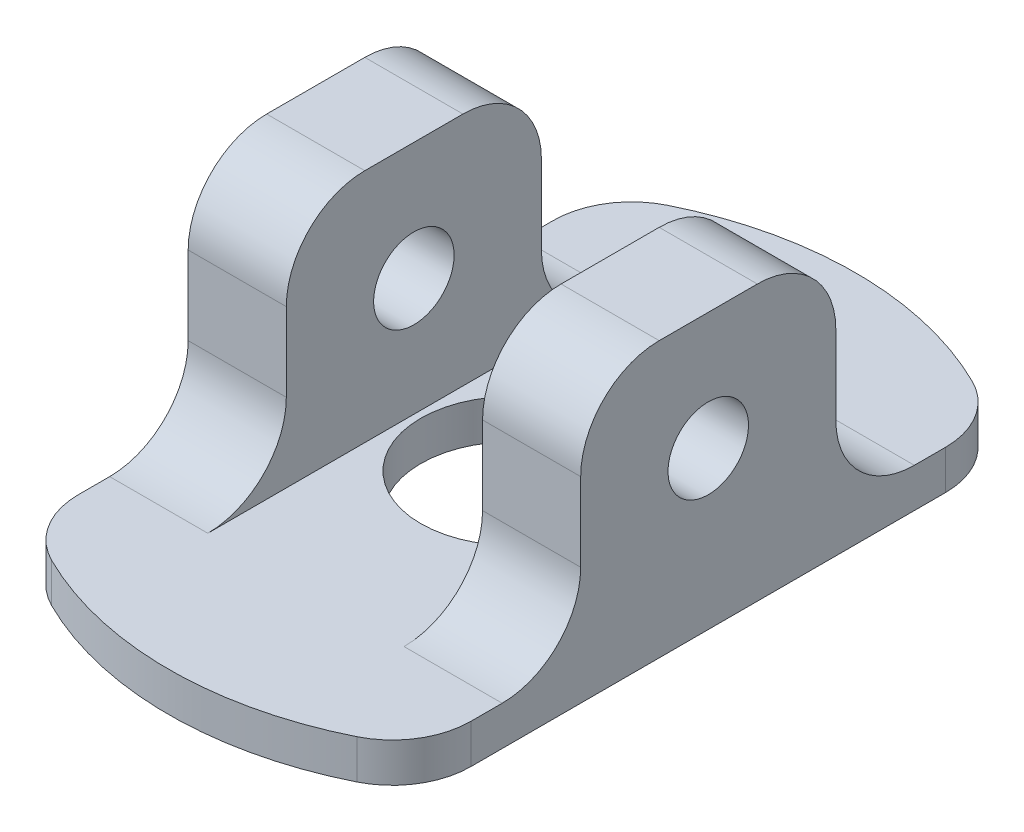
ISO-10303-21;
HEADER;
FILE_DESCRIPTION(('STEP AP214'),'2;1');
FILE_NAME('part.step','',(''),(''),'','','');
FILE_SCHEMA(('AUTOMOTIVE_DESIGN { 1 0 10303 214 1 1 1 1 }'));
ENDSEC;
DATA;
#1=APPLICATION_CONTEXT('core data for automotive mechanical design processes');
#2=APPLICATION_PROTOCOL_DEFINITION('international standard','automotive_design',2000,#1);
#3=PRODUCT_CONTEXT('',#1,'mechanical');
#4=PRODUCT('Part','Part','',(#3));
#5=PRODUCT_RELATED_PRODUCT_CATEGORY('part','',(#4));
#6=PRODUCT_DEFINITION_FORMATION('','',#4);
#7=PRODUCT_DEFINITION_CONTEXT('part definition',#1,'design');
#8=PRODUCT_DEFINITION('design','',#6,#7);
#9=PRODUCT_DEFINITION_SHAPE('','',#8);
#10=(LENGTH_UNIT() NAMED_UNIT(*) SI_UNIT(.MILLI.,.METRE.));
#11=(NAMED_UNIT(*) PLANE_ANGLE_UNIT() SI_UNIT($,.RADIAN.));
#12=(NAMED_UNIT(*) SI_UNIT($,.STERADIAN.) SOLID_ANGLE_UNIT());
#13=UNCERTAINTY_MEASURE_WITH_UNIT(LENGTH_MEASURE(1.E-05),#10,'distance_accuracy_value','');
#14=(GEOMETRIC_REPRESENTATION_CONTEXT(3) GLOBAL_UNCERTAINTY_ASSIGNED_CONTEXT((#13)) GLOBAL_UNIT_ASSIGNED_CONTEXT((#10,
#11,#12)) REPRESENTATION_CONTEXT('',''));
#15=CARTESIAN_POINT('',(0.,0.,0.));
#16=DIRECTION('',(0.,0.,1.));
#17=DIRECTION('',(1.,0.,0.));
#18=AXIS2_PLACEMENT_3D('',#15,#16,#17);
#19=CARTESIAN_POINT('',(0.,14.,0.));
#20=DIRECTION('',(0.,-1.,0.));
#21=DIRECTION('',(0.,0.,-1.));
#22=AXIS2_PLACEMENT_3D('',#19,#20,#21);
#23=CYLINDRICAL_SURFACE('',#22,17.5);
#24=CARTESIAN_POINT('',(0.,14.,0.));
#25=DIRECTION('',(0.,1.,0.));
#26=DIRECTION('',(0.,0.,1.));
#27=AXIS2_PLACEMENT_3D('',#24,#25,#26);
#28=CIRCLE('',#27,17.5);
#29=CARTESIAN_POINT('',(-7.77777777777778,14.,15.6766122883583));
#30=VERTEX_POINT('',#29);
#31=CARTESIAN_POINT('',(7.77777777777778,14.,15.6766122883583));
#32=VERTEX_POINT('',#31);
#33=EDGE_CURVE('E291',#30,#32,#28,.T.);
#34=ORIENTED_EDGE('',*,*,#33,.F.);
#35=DIRECTION('',(0.,-1.,0.));
#36=VECTOR('',#35,1.);
#37=CARTESIAN_POINT('',(-7.77777777777778,14.,15.6766122883583));
#38=LINE('',#37,#36);
#39=CARTESIAN_POINT('',(-7.77777777777778,12.,15.6766122883583));
#40=VERTEX_POINT('',#39);
#41=EDGE_CURVE('E11',#30,#40,#38,.T.);
#42=ORIENTED_EDGE('',*,*,#41,.T.);
#43=CARTESIAN_POINT('',(0.,12.,0.));
#44=DIRECTION('',(0.,1.,0.));
#45=DIRECTION('',(0.,0.,1.));
#46=AXIS2_PLACEMENT_3D('',#43,#44,#45);
#47=CIRCLE('',#46,17.5);
#48=CARTESIAN_POINT('',(7.77777777777778,12.,15.6766122883583));
#49=VERTEX_POINT('',#48);
#50=EDGE_CURVE('E293',#40,#49,#47,.T.);
#51=ORIENTED_EDGE('',*,*,#50,.T.);
#52=DIRECTION('',(0.,-1.,0.));
#53=VECTOR('',#52,1.);
#54=CARTESIAN_POINT('',(7.77777777777778,14.,15.6766122883583));
#55=LINE('',#54,#53);
#56=EDGE_CURVE('E42',#49,#32,#55,.F.);
#57=ORIENTED_EDGE('',*,*,#56,.T.);
#58=EDGE_LOOP('',(#34,#42,#51,#57));
#59=FACE_BOUND('',#58,.T.);
#60=ADVANCED_FACE('F34',(#59),#23,.T.);
#61=CARTESIAN_POINT('',(0.,14.,0.));
#62=DIRECTION('',(0.,1.,0.));
#63=DIRECTION('',(0.,0.,1.));
#64=AXIS2_PLACEMENT_3D('',#61,#62,#63);
#65=PLANE('',#64);
#66=CARTESIAN_POINT('',(0.,14.,0.));
#67=DIRECTION('',(0.,1.,0.));
#68=DIRECTION('',(0.,0.,1.));
#69=AXIS2_PLACEMENT_3D('',#66,#67,#68);
#70=CIRCLE('',#69,4.65);
#71=CARTESIAN_POINT('',(0.,14.,4.65));
#72=VERTEX_POINT('',#71);
#73=EDGE_CURVE('E408',#72,#72,#70,.T.);
#74=ORIENTED_EDGE('',*,*,#73,.F.);
#75=EDGE_LOOP('',(#74));
#76=FACE_BOUND('',#75,.T.);
#77=DIRECTION('',(0.,0.,-1.));
#78=VECTOR('',#77,1.);
#79=CARTESIAN_POINT('',(10.,14.,0.));
#80=LINE('',#79,#78);
#81=CARTESIAN_POINT('',(10.,14.,-10.5));
#82=VERTEX_POINT('',#81);
#83=CARTESIAN_POINT('',(10.,14.,-12.0933866224478));
#84=VERTEX_POINT('',#83);
#85=EDGE_CURVE('E399',#82,#84,#80,.T.);
#86=ORIENTED_EDGE('',*,*,#85,.T.);
#87=CARTESIAN_POINT('',(6.,14.,-12.0933866224478));
#88=DIRECTION('',(0.,1.,0.));
#89=DIRECTION('',(0.,0.,1.));
#90=AXIS2_PLACEMENT_3D('',#87,#88,#89);
#91=CIRCLE('',#90,4.);
#92=CARTESIAN_POINT('',(7.77777777777777,14.,-15.6766122883583));
#93=VERTEX_POINT('',#92);
#94=EDGE_CURVE('E268',#84,#93,#91,.T.);
#95=ORIENTED_EDGE('',*,*,#94,.T.);
#96=CARTESIAN_POINT('',(-7.77777777777777,14.,-15.6766122883583));
#97=VERTEX_POINT('',#96);
#98=EDGE_CURVE('E298',#93,#97,#28,.T.);
#99=ORIENTED_EDGE('',*,*,#98,.T.);
#100=CARTESIAN_POINT('',(-6.,14.,-12.0933866224478));
#101=DIRECTION('',(0.,1.,0.));
#102=DIRECTION('',(0.,0.,1.));
#103=AXIS2_PLACEMENT_3D('',#100,#101,#102);
#104=CIRCLE('',#103,4.);
#105=CARTESIAN_POINT('',(-10.,14.,-12.0933866224478));
#106=VERTEX_POINT('',#105);
#107=EDGE_CURVE('E203',#97,#106,#104,.T.);
#108=ORIENTED_EDGE('',*,*,#107,.T.);
#109=DIRECTION('',(0.,0.,-1.));
#110=VECTOR('',#109,1.);
#111=CARTESIAN_POINT('',(-10.,14.,0.));
#112=LINE('',#111,#110);
#113=CARTESIAN_POINT('',(-10.,14.,-10.5));
#114=VERTEX_POINT('',#113);
#115=EDGE_CURVE('E195',#114,#106,#112,.T.);
#116=ORIENTED_EDGE('',*,*,#115,.F.);
#117=DIRECTION('',(-1.,0.,0.));
#118=VECTOR('',#117,1.);
#119=CARTESIAN_POINT('',(0.,14.,-10.5));
#120=LINE('',#119,#118);
#121=CARTESIAN_POINT('',(-5.,14.,-10.5));
#122=VERTEX_POINT('',#121);
#123=EDGE_CURVE('E200',#114,#122,#120,.F.);
#124=ORIENTED_EDGE('',*,*,#123,.T.);
#125=DIRECTION('',(0.,0.,1.));
#126=VECTOR('',#125,1.);
#127=CARTESIAN_POINT('',(-5.,14.,-6.5));
#128=LINE('',#127,#126);
#129=CARTESIAN_POINT('',(-5.,14.,10.5));
#130=VERTEX_POINT('',#129);
#131=EDGE_CURVE('E388',#122,#130,#128,.T.);
#132=ORIENTED_EDGE('',*,*,#131,.T.);
#133=DIRECTION('',(-1.,0.,0.));
#134=VECTOR('',#133,1.);
#135=CARTESIAN_POINT('',(-10.,14.,10.5));
#136=LINE('',#135,#134);
#137=CARTESIAN_POINT('',(-10.,14.,10.5));
#138=VERTEX_POINT('',#137);
#139=EDGE_CURVE('E220',#130,#138,#136,.T.);
#140=ORIENTED_EDGE('',*,*,#139,.T.);
#141=CARTESIAN_POINT('',(-10.,14.,12.0933866224478));
#142=VERTEX_POINT('',#141);
#143=EDGE_CURVE('E204',#142,#138,#112,.T.);
#144=ORIENTED_EDGE('',*,*,#143,.F.);
#145=CARTESIAN_POINT('',(-6.,14.,12.0933866224478));
#146=DIRECTION('',(0.,1.,0.));
#147=DIRECTION('',(0.,0.,1.));
#148=AXIS2_PLACEMENT_3D('',#145,#146,#147);
#149=CIRCLE('',#148,4.);
#150=EDGE_CURVE('E265',#142,#30,#149,.T.);
#151=ORIENTED_EDGE('',*,*,#150,.T.);
#152=ORIENTED_EDGE('',*,*,#33,.T.);
#153=CARTESIAN_POINT('',(6.,14.,12.0933866224478));
#154=DIRECTION('',(0.,1.,0.));
#155=DIRECTION('',(0.,0.,1.));
#156=AXIS2_PLACEMENT_3D('',#153,#154,#155);
#157=CIRCLE('',#156,4.);
#158=CARTESIAN_POINT('',(10.,14.,12.0933866224478));
#159=VERTEX_POINT('',#158);
#160=EDGE_CURVE('E263',#32,#159,#157,.T.);
#161=ORIENTED_EDGE('',*,*,#160,.T.);
#162=CARTESIAN_POINT('',(10.,14.,10.5));
#163=VERTEX_POINT('',#162);
#164=EDGE_CURVE('E346',#159,#163,#80,.T.);
#165=ORIENTED_EDGE('',*,*,#164,.T.);
#166=DIRECTION('',(1.,0.,0.));
#167=VECTOR('',#166,1.);
#168=CARTESIAN_POINT('',(0.,14.,10.5));
#169=LINE('',#168,#167);
#170=CARTESIAN_POINT('',(5.,14.,10.5));
#171=VERTEX_POINT('',#170);
#172=EDGE_CURVE('E226',#163,#171,#169,.F.);
#173=ORIENTED_EDGE('',*,*,#172,.T.);
#174=DIRECTION('',(0.,0.,1.));
#175=VECTOR('',#174,1.);
#176=CARTESIAN_POINT('',(5.,14.,-6.5));
#177=LINE('',#176,#175);
#178=CARTESIAN_POINT('',(5.,14.,-10.5));
#179=VERTEX_POINT('',#178);
#180=EDGE_CURVE('E345',#179,#171,#177,.T.);
#181=ORIENTED_EDGE('',*,*,#180,.F.);
#182=DIRECTION('',(1.,0.,0.));
#183=VECTOR('',#182,1.);
#184=CARTESIAN_POINT('',(10.,14.,-10.5));
#185=LINE('',#184,#183);
#186=EDGE_CURVE('E219',#179,#82,#185,.T.);
#187=ORIENTED_EDGE('',*,*,#186,.T.);
#188=EDGE_LOOP('',(#86,#95,#99,#108,#116,#124,#132,#140,#144,#151,#152,#161,#165,#173,#181,#187));
#189=FACE_BOUND('',#188,.T.);
#190=ADVANCED_FACE('F198',(#76,#189),#65,.T.);
#191=ORIENTED_EDGE('',*,*,#98,.F.);
#192=DIRECTION('',(0.,-1.,0.));
#193=VECTOR('',#192,1.);
#194=CARTESIAN_POINT('',(7.77777777777778,14.,-15.6766122883583));
#195=LINE('',#194,#193);
#196=CARTESIAN_POINT('',(7.77777777777777,12.,-15.6766122883583));
#197=VERTEX_POINT('',#196);
#198=EDGE_CURVE('E273',#93,#197,#195,.T.);
#199=ORIENTED_EDGE('',*,*,#198,.T.);
#200=CARTESIAN_POINT('',(-7.77777777777777,12.,-15.6766122883583));
#201=VERTEX_POINT('',#200);
#202=EDGE_CURVE('E299',#197,#201,#47,.T.);
#203=ORIENTED_EDGE('',*,*,#202,.T.);
#204=DIRECTION('',(0.,-1.,0.));
#205=VECTOR('',#204,1.);
#206=CARTESIAN_POINT('',(-7.77777777777778,14.,-15.6766122883583));
#207=LINE('',#206,#205);
#208=EDGE_CURVE('E270',#201,#97,#207,.F.);
#209=ORIENTED_EDGE('',*,*,#208,.T.);
#210=EDGE_LOOP('',(#191,#199,#203,#209));
#211=FACE_BOUND('',#210,.T.);
#212=ADVANCED_FACE('F428',(#211),#23,.T.);
#213=CARTESIAN_POINT('',(0.,12.,0.));
#214=DIRECTION('',(0.,1.,0.));
#215=DIRECTION('',(0.,0.,1.));
#216=AXIS2_PLACEMENT_3D('',#213,#214,#215);
#217=PLANE('',#216);
#218=CARTESIAN_POINT('',(0.,12.,0.));
#219=DIRECTION('',(0.,1.,0.));
#220=DIRECTION('',(0.,0.,1.));
#221=AXIS2_PLACEMENT_3D('',#218,#219,#220);
#222=CIRCLE('',#221,4.65);
#223=CARTESIAN_POINT('',(0.,12.,4.65));
#224=VERTEX_POINT('',#223);
#225=EDGE_CURVE('E411',#224,#224,#222,.T.);
#226=ORIENTED_EDGE('',*,*,#225,.T.);
#227=EDGE_LOOP('',(#226));
#228=FACE_BOUND('',#227,.T.);
#229=ORIENTED_EDGE('',*,*,#202,.F.);
#230=CARTESIAN_POINT('',(6.,12.,-12.0933866224478));
#231=DIRECTION('',(0.,1.,0.));
#232=DIRECTION('',(0.,0.,1.));
#233=AXIS2_PLACEMENT_3D('',#230,#231,#232);
#234=CIRCLE('',#233,4.);
#235=CARTESIAN_POINT('',(10.,12.,-12.0933866224478));
#236=VERTEX_POINT('',#235);
#237=EDGE_CURVE('E280',#197,#236,#234,.F.);
#238=ORIENTED_EDGE('',*,*,#237,.T.);
#239=DIRECTION('',(0.,0.,-1.));
#240=VECTOR('',#239,1.);
#241=CARTESIAN_POINT('',(10.,12.,0.));
#242=LINE('',#241,#240);
#243=CARTESIAN_POINT('',(10.,12.,12.0933866224478));
#244=VERTEX_POINT('',#243);
#245=EDGE_CURVE('E391',#244,#236,#242,.T.);
#246=ORIENTED_EDGE('',*,*,#245,.F.);
#247=CARTESIAN_POINT('',(6.,12.,12.0933866224478));
#248=DIRECTION('',(0.,1.,0.));
#249=DIRECTION('',(0.,0.,1.));
#250=AXIS2_PLACEMENT_3D('',#247,#248,#249);
#251=CIRCLE('',#250,4.);
#252=EDGE_CURVE('E275',#244,#49,#251,.F.);
#253=ORIENTED_EDGE('',*,*,#252,.T.);
#254=ORIENTED_EDGE('',*,*,#50,.F.);
#255=CARTESIAN_POINT('',(-6.,12.,12.0933866224478));
#256=DIRECTION('',(0.,1.,0.));
#257=DIRECTION('',(0.,0.,1.));
#258=AXIS2_PLACEMENT_3D('',#255,#256,#257);
#259=CIRCLE('',#258,4.);
#260=CARTESIAN_POINT('',(-10.,12.,12.0933866224478));
#261=VERTEX_POINT('',#260);
#262=EDGE_CURVE('E56',#40,#261,#259,.F.);
#263=ORIENTED_EDGE('',*,*,#262,.T.);
#264=DIRECTION('',(0.,0.,-1.));
#265=VECTOR('',#264,1.);
#266=CARTESIAN_POINT('',(-10.,12.,0.));
#267=LINE('',#266,#265);
#268=CARTESIAN_POINT('',(-10.,12.,-12.0933866224478));
#269=VERTEX_POINT('',#268);
#270=EDGE_CURVE('E400',#261,#269,#267,.T.);
#271=ORIENTED_EDGE('',*,*,#270,.T.);
#272=CARTESIAN_POINT('',(-6.,12.,-12.0933866224478));
#273=DIRECTION('',(0.,1.,0.));
#274=DIRECTION('',(0.,0.,1.));
#275=AXIS2_PLACEMENT_3D('',#272,#273,#274);
#276=CIRCLE('',#275,4.);
#277=EDGE_CURVE('E278',#269,#201,#276,.F.);
#278=ORIENTED_EDGE('',*,*,#277,.T.);
#279=EDGE_LOOP('',(#229,#238,#246,#253,#254,#263,#271,#278));
#280=FACE_BOUND('',#279,.T.);
#281=ADVANCED_FACE('F415',(#228,#280),#217,.F.);
#282=CARTESIAN_POINT('',(5.,26.,-6.5));
#283=DIRECTION('',(1.,0.,0.));
#284=DIRECTION('',(0.,0.,-1.));
#285=AXIS2_PLACEMENT_3D('',#282,#283,#284);
#286=PLANE('',#285);
#287=CARTESIAN_POINT('',(5.,20.,0.));
#288=DIRECTION('',(1.,0.,0.));
#289=DIRECTION('',(0.,0.,-1.));
#290=AXIS2_PLACEMENT_3D('',#287,#288,#289);
#291=CIRCLE('',#290,2.05);
#292=CARTESIAN_POINT('',(5.,20.,-2.05));
#293=VERTEX_POINT('',#292);
#294=EDGE_CURVE('E205',#293,#293,#291,.T.);
#295=ORIENTED_EDGE('',*,*,#294,.T.);
#296=EDGE_LOOP('',(#295));
#297=FACE_BOUND('',#296,.T.);
#298=DIRECTION('',(0.,0.,1.));
#299=VECTOR('',#298,1.);
#300=CARTESIAN_POINT('',(5.,26.,-6.5));
#301=LINE('',#300,#299);
#302=CARTESIAN_POINT('',(5.,26.,-2.5));
#303=VERTEX_POINT('',#302);
#304=CARTESIAN_POINT('',(5.,26.,2.5));
#305=VERTEX_POINT('',#304);
#306=EDGE_CURVE('E372',#303,#305,#301,.T.);
#307=ORIENTED_EDGE('',*,*,#306,.F.);
#308=CARTESIAN_POINT('',(5.,22.,-2.5));
#309=DIRECTION('',(1.,0.,0.));
#310=DIRECTION('',(0.,0.,-1.));
#311=AXIS2_PLACEMENT_3D('',#308,#309,#310);
#312=CIRCLE('',#311,4.);
#313=CARTESIAN_POINT('',(5.,22.,-6.5));
#314=VERTEX_POINT('',#313);
#315=EDGE_CURVE('E336',#303,#314,#312,.F.);
#316=ORIENTED_EDGE('',*,*,#315,.T.);
#317=DIRECTION('',(0.,-1.,0.));
#318=VECTOR('',#317,1.);
#319=CARTESIAN_POINT('',(5.,26.,-6.5));
#320=LINE('',#319,#318);
#321=CARTESIAN_POINT('',(5.,18.,-6.5));
#322=VERTEX_POINT('',#321);
#323=EDGE_CURVE('E365',#314,#322,#320,.T.);
#324=ORIENTED_EDGE('',*,*,#323,.T.);
#325=CARTESIAN_POINT('',(5.,18.,-10.5));
#326=DIRECTION('',(1.,0.,0.));
#327=DIRECTION('',(0.,0.,-1.));
#328=AXIS2_PLACEMENT_3D('',#325,#326,#327);
#329=CIRCLE('',#328,4.);
#330=EDGE_CURVE('E216',#322,#179,#329,.T.);
#331=ORIENTED_EDGE('',*,*,#330,.T.);
#332=ORIENTED_EDGE('',*,*,#180,.T.);
#333=CARTESIAN_POINT('',(5.,18.,10.5));
#334=DIRECTION('',(1.,0.,0.));
#335=DIRECTION('',(0.,0.,-1.));
#336=AXIS2_PLACEMENT_3D('',#333,#334,#335);
#337=CIRCLE('',#336,4.);
#338=CARTESIAN_POINT('',(5.,18.,6.5));
#339=VERTEX_POINT('',#338);
#340=EDGE_CURVE('E251',#171,#339,#337,.T.);
#341=ORIENTED_EDGE('',*,*,#340,.T.);
#342=DIRECTION('',(0.,-1.,0.));
#343=VECTOR('',#342,1.);
#344=CARTESIAN_POINT('',(5.,26.,6.5));
#345=LINE('',#344,#343);
#346=CARTESIAN_POINT('',(5.,22.,6.5));
#347=VERTEX_POINT('',#346);
#348=EDGE_CURVE('E305',#347,#339,#345,.T.);
#349=ORIENTED_EDGE('',*,*,#348,.F.);
#350=CARTESIAN_POINT('',(5.,22.,2.5));
#351=DIRECTION('',(1.,0.,0.));
#352=DIRECTION('',(0.,0.,-1.));
#353=AXIS2_PLACEMENT_3D('',#350,#351,#352);
#354=CIRCLE('',#353,4.);
#355=EDGE_CURVE('E334',#347,#305,#354,.F.);
#356=ORIENTED_EDGE('',*,*,#355,.T.);
#357=EDGE_LOOP('',(#307,#316,#324,#331,#332,#341,#349,#356));
#358=FACE_BOUND('',#357,.T.);
#359=ADVANCED_FACE('F354',(#297,#358),#286,.F.);
#360=CARTESIAN_POINT('',(5.,26.,6.5));
#361=DIRECTION('',(0.,0.,-1.));
#362=DIRECTION('',(-1.,0.,0.));
#363=AXIS2_PLACEMENT_3D('',#360,#361,#362);
#364=PLANE('',#363);
#365=ORIENTED_EDGE('',*,*,#348,.T.);
#366=DIRECTION('',(1.,0.,0.));
#367=VECTOR('',#366,1.);
#368=CARTESIAN_POINT('',(5.,18.,6.5));
#369=LINE('',#368,#367);
#370=CARTESIAN_POINT('',(10.,18.,6.5));
#371=VERTEX_POINT('',#370);
#372=EDGE_CURVE('E235',#339,#371,#369,.T.);
#373=ORIENTED_EDGE('',*,*,#372,.T.);
#374=DIRECTION('',(0.,-1.,0.));
#375=VECTOR('',#374,1.);
#376=CARTESIAN_POINT('',(10.,26.,6.5));
#377=LINE('',#376,#375);
#378=CARTESIAN_POINT('',(10.,22.,6.5));
#379=VERTEX_POINT('',#378);
#380=EDGE_CURVE('E361',#379,#371,#377,.T.);
#381=ORIENTED_EDGE('',*,*,#380,.F.);
#382=DIRECTION('',(1.,0.,0.));
#383=VECTOR('',#382,1.);
#384=CARTESIAN_POINT('',(5.,22.,6.5));
#385=LINE('',#384,#383);
#386=EDGE_CURVE('E338',#379,#347,#385,.F.);
#387=ORIENTED_EDGE('',*,*,#386,.T.);
#388=EDGE_LOOP('',(#365,#373,#381,#387));
#389=FACE_BOUND('',#388,.T.);
#390=ADVANCED_FACE('F357',(#389),#364,.F.);
#391=CARTESIAN_POINT('',(10.,26.,-6.5));
#392=DIRECTION('',(1.,0.,0.));
#393=DIRECTION('',(0.,0.,-1.));
#394=AXIS2_PLACEMENT_3D('',#391,#392,#393);
#395=PLANE('',#394);
#396=CARTESIAN_POINT('',(10.,20.,0.));
#397=DIRECTION('',(1.,0.,0.));
#398=DIRECTION('',(0.,0.,-1.));
#399=AXIS2_PLACEMENT_3D('',#396,#397,#398);
#400=CIRCLE('',#399,2.05);
#401=CARTESIAN_POINT('',(10.,20.,-2.05));
#402=VERTEX_POINT('',#401);
#403=EDGE_CURVE('E258',#402,#402,#400,.T.);
#404=ORIENTED_EDGE('',*,*,#403,.F.);
#405=EDGE_LOOP('',(#404));
#406=FACE_BOUND('',#405,.T.);
#407=ORIENTED_EDGE('',*,*,#245,.T.);
#408=DIRECTION('',(0.,1.,0.));
#409=VECTOR('',#408,1.);
#410=CARTESIAN_POINT('',(10.,14.,-12.0933866224478));
#411=LINE('',#410,#409);
#412=EDGE_CURVE('E260',#236,#84,#411,.T.);
#413=ORIENTED_EDGE('',*,*,#412,.T.);
#414=ORIENTED_EDGE('',*,*,#85,.F.);
#415=CARTESIAN_POINT('',(10.,18.,-10.5));
#416=DIRECTION('',(1.,0.,0.));
#417=DIRECTION('',(0.,0.,-1.));
#418=AXIS2_PLACEMENT_3D('',#415,#416,#417);
#419=CIRCLE('',#418,4.);
#420=CARTESIAN_POINT('',(10.,18.,-6.5));
#421=VERTEX_POINT('',#420);
#422=EDGE_CURVE('E238',#82,#421,#419,.F.);
#423=ORIENTED_EDGE('',*,*,#422,.T.);
#424=DIRECTION('',(0.,-1.,0.));
#425=VECTOR('',#424,1.);
#426=CARTESIAN_POINT('',(10.,26.,-6.5));
#427=LINE('',#426,#425);
#428=CARTESIAN_POINT('',(10.,22.,-6.5));
#429=VERTEX_POINT('',#428);
#430=EDGE_CURVE('E362',#429,#421,#427,.T.);
#431=ORIENTED_EDGE('',*,*,#430,.F.);
#432=CARTESIAN_POINT('',(10.,22.,-2.5));
#433=DIRECTION('',(1.,0.,0.));
#434=DIRECTION('',(0.,0.,-1.));
#435=AXIS2_PLACEMENT_3D('',#432,#433,#434);
#436=CIRCLE('',#435,4.);
#437=CARTESIAN_POINT('',(10.,26.,-2.5));
#438=VERTEX_POINT('',#437);
#439=EDGE_CURVE('E327',#429,#438,#436,.T.);
#440=ORIENTED_EDGE('',*,*,#439,.T.);
#441=DIRECTION('',(0.,0.,1.));
#442=VECTOR('',#441,1.);
#443=CARTESIAN_POINT('',(10.,26.,-6.5));
#444=LINE('',#443,#442);
#445=CARTESIAN_POINT('',(10.,26.,2.5));
#446=VERTEX_POINT('',#445);
#447=EDGE_CURVE('E370',#438,#446,#444,.T.);
#448=ORIENTED_EDGE('',*,*,#447,.T.);
#449=CARTESIAN_POINT('',(10.,22.,2.5));
#450=DIRECTION('',(1.,0.,0.));
#451=DIRECTION('',(0.,0.,-1.));
#452=AXIS2_PLACEMENT_3D('',#449,#450,#451);
#453=CIRCLE('',#452,4.);
#454=EDGE_CURVE('E325',#446,#379,#453,.T.);
#455=ORIENTED_EDGE('',*,*,#454,.T.);
#456=ORIENTED_EDGE('',*,*,#380,.T.);
#457=CARTESIAN_POINT('',(10.,18.,10.5));
#458=DIRECTION('',(1.,0.,0.));
#459=DIRECTION('',(0.,0.,-1.));
#460=AXIS2_PLACEMENT_3D('',#457,#458,#459);
#461=CIRCLE('',#460,4.);
#462=EDGE_CURVE('E248',#371,#163,#461,.F.);
#463=ORIENTED_EDGE('',*,*,#462,.T.);
#464=ORIENTED_EDGE('',*,*,#164,.F.);
#465=DIRECTION('',(0.,1.,0.));
#466=VECTOR('',#465,1.);
#467=CARTESIAN_POINT('',(10.,12.,12.0933866224478));
#468=LINE('',#467,#466);
#469=EDGE_CURVE('E253',#159,#244,#468,.F.);
#470=ORIENTED_EDGE('',*,*,#469,.T.);
#471=EDGE_LOOP('',(#407,#413,#414,#423,#431,#440,#448,#455,#456,#463,#464,#470));
#472=FACE_BOUND('',#471,.T.);
#473=ADVANCED_FACE('F451',(#406,#472),#395,.T.);
#474=CARTESIAN_POINT('',(5.,26.,-6.5));
#475=DIRECTION('',(0.,0.,-1.));
#476=DIRECTION('',(-1.,0.,0.));
#477=AXIS2_PLACEMENT_3D('',#474,#475,#476);
#478=PLANE('',#477);
#479=ORIENTED_EDGE('',*,*,#430,.T.);
#480=DIRECTION('',(1.,0.,0.));
#481=VECTOR('',#480,1.);
#482=CARTESIAN_POINT('',(5.,18.,-6.5));
#483=LINE('',#482,#481);
#484=EDGE_CURVE('E223',#421,#322,#483,.F.);
#485=ORIENTED_EDGE('',*,*,#484,.T.);
#486=ORIENTED_EDGE('',*,*,#323,.F.);
#487=DIRECTION('',(1.,0.,0.));
#488=VECTOR('',#487,1.);
#489=CARTESIAN_POINT('',(5.,22.,-6.5));
#490=LINE('',#489,#488);
#491=EDGE_CURVE('E322',#314,#429,#490,.T.);
#492=ORIENTED_EDGE('',*,*,#491,.T.);
#493=EDGE_LOOP('',(#479,#485,#486,#492));
#494=FACE_BOUND('',#493,.T.);
#495=ADVANCED_FACE('F493',(#494),#478,.T.);
#496=CARTESIAN_POINT('',(0.,26.,0.));
#497=DIRECTION('',(0.,1.,0.));
#498=DIRECTION('',(0.,0.,1.));
#499=AXIS2_PLACEMENT_3D('',#496,#497,#498);
#500=PLANE('',#499);
#501=ORIENTED_EDGE('',*,*,#447,.F.);
#502=DIRECTION('',(1.,0.,0.));
#503=VECTOR('',#502,1.);
#504=CARTESIAN_POINT('',(0.,26.,-2.5));
#505=LINE('',#504,#503);
#506=EDGE_CURVE('E332',#438,#303,#505,.F.);
#507=ORIENTED_EDGE('',*,*,#506,.T.);
#508=ORIENTED_EDGE('',*,*,#306,.T.);
#509=DIRECTION('',(1.,0.,0.));
#510=VECTOR('',#509,1.);
#511=CARTESIAN_POINT('',(10.,26.,2.5));
#512=LINE('',#511,#510);
#513=EDGE_CURVE('E329',#305,#446,#512,.T.);
#514=ORIENTED_EDGE('',*,*,#513,.T.);
#515=EDGE_LOOP('',(#501,#507,#508,#514));
#516=FACE_BOUND('',#515,.T.);
#517=ADVANCED_FACE('F485',(#516),#500,.T.);
#518=CARTESIAN_POINT('',(-5.,26.,-6.5));
#519=DIRECTION('',(1.,0.,0.));
#520=DIRECTION('',(0.,0.,-1.));
#521=AXIS2_PLACEMENT_3D('',#518,#519,#520);
#522=PLANE('',#521);
#523=CARTESIAN_POINT('',(-5.,20.,0.));
#524=DIRECTION('',(1.,0.,0.));
#525=DIRECTION('',(0.,0.,-1.));
#526=AXIS2_PLACEMENT_3D('',#523,#524,#525);
#527=CIRCLE('',#526,2.05);
#528=CARTESIAN_POINT('',(-5.,20.,-2.05));
#529=VERTEX_POINT('',#528);
#530=EDGE_CURVE('E257',#529,#529,#527,.T.);
#531=ORIENTED_EDGE('',*,*,#530,.F.);
#532=EDGE_LOOP('',(#531));
#533=FACE_BOUND('',#532,.T.);
#534=DIRECTION('',(0.,-1.,0.));
#535=VECTOR('',#534,1.);
#536=CARTESIAN_POINT('',(-5.,26.,-6.5));
#537=LINE('',#536,#535);
#538=CARTESIAN_POINT('',(-5.,22.,-6.5));
#539=VERTEX_POINT('',#538);
#540=CARTESIAN_POINT('',(-5.,18.,-6.5));
#541=VERTEX_POINT('',#540);
#542=EDGE_CURVE('E373',#539,#541,#537,.T.);
#543=ORIENTED_EDGE('',*,*,#542,.F.);
#544=CARTESIAN_POINT('',(-5.,22.,-2.5));
#545=DIRECTION('',(1.,0.,0.));
#546=DIRECTION('',(0.,0.,-1.));
#547=AXIS2_PLACEMENT_3D('',#544,#545,#546);
#548=CIRCLE('',#547,4.);
#549=CARTESIAN_POINT('',(-5.,26.,-2.5));
#550=VERTEX_POINT('',#549);
#551=EDGE_CURVE('E320',#539,#550,#548,.T.);
#552=ORIENTED_EDGE('',*,*,#551,.T.);
#553=DIRECTION('',(0.,0.,1.));
#554=VECTOR('',#553,1.);
#555=CARTESIAN_POINT('',(-5.,26.,-6.5));
#556=LINE('',#555,#554);
#557=CARTESIAN_POINT('',(-5.,26.,2.5));
#558=VERTEX_POINT('',#557);
#559=EDGE_CURVE('E390',#550,#558,#556,.T.);
#560=ORIENTED_EDGE('',*,*,#559,.T.);
#561=CARTESIAN_POINT('',(-5.,22.,2.5));
#562=DIRECTION('',(1.,0.,0.));
#563=DIRECTION('',(0.,0.,-1.));
#564=AXIS2_PLACEMENT_3D('',#561,#562,#563);
#565=CIRCLE('',#564,4.);
#566=CARTESIAN_POINT('',(-5.,22.,6.5));
#567=VERTEX_POINT('',#566);
#568=EDGE_CURVE('E318',#558,#567,#565,.T.);
#569=ORIENTED_EDGE('',*,*,#568,.T.);
#570=DIRECTION('',(0.,-1.,0.));
#571=VECTOR('',#570,1.);
#572=CARTESIAN_POINT('',(-5.,26.,6.5));
#573=LINE('',#572,#571);
#574=CARTESIAN_POINT('',(-5.,18.,6.5));
#575=VERTEX_POINT('',#574);
#576=EDGE_CURVE('E384',#567,#575,#573,.T.);
#577=ORIENTED_EDGE('',*,*,#576,.T.);
#578=CARTESIAN_POINT('',(-5.,18.,10.5));
#579=DIRECTION('',(1.,0.,0.));
#580=DIRECTION('',(0.,0.,-1.));
#581=AXIS2_PLACEMENT_3D('',#578,#579,#580);
#582=CIRCLE('',#581,4.);
#583=EDGE_CURVE('E245',#575,#130,#582,.F.);
#584=ORIENTED_EDGE('',*,*,#583,.T.);
#585=ORIENTED_EDGE('',*,*,#131,.F.);
#586=CARTESIAN_POINT('',(-5.,18.,-10.5));
#587=DIRECTION('',(1.,0.,0.));
#588=DIRECTION('',(0.,0.,-1.));
#589=AXIS2_PLACEMENT_3D('',#586,#587,#588);
#590=CIRCLE('',#589,4.);
#591=EDGE_CURVE('E215',#122,#541,#590,.F.);
#592=ORIENTED_EDGE('',*,*,#591,.T.);
#593=EDGE_LOOP('',(#543,#552,#560,#569,#577,#584,#585,#592));
#594=FACE_BOUND('',#593,.T.);
#595=ADVANCED_FACE('F483',(#533,#594),#522,.T.);
#596=CARTESIAN_POINT('',(-5.,26.,-6.5));
#597=DIRECTION('',(0.,0.,1.));
#598=DIRECTION('',(1.,0.,0.));
#599=AXIS2_PLACEMENT_3D('',#596,#597,#598);
#600=PLANE('',#599);
#601=ORIENTED_EDGE('',*,*,#542,.T.);
#602=DIRECTION('',(-1.,0.,0.));
#603=VECTOR('',#602,1.);
#604=CARTESIAN_POINT('',(-5.,18.,-6.5));
#605=LINE('',#604,#603);
#606=CARTESIAN_POINT('',(-10.,18.,-6.5));
#607=VERTEX_POINT('',#606);
#608=EDGE_CURVE('E231',#541,#607,#605,.T.);
#609=ORIENTED_EDGE('',*,*,#608,.T.);
#610=DIRECTION('',(0.,-1.,0.));
#611=VECTOR('',#610,1.);
#612=CARTESIAN_POINT('',(-10.,26.,-6.5));
#613=LINE('',#612,#611);
#614=CARTESIAN_POINT('',(-10.,22.,-6.5));
#615=VERTEX_POINT('',#614);
#616=EDGE_CURVE('E211',#615,#607,#613,.T.);
#617=ORIENTED_EDGE('',*,*,#616,.F.);
#618=DIRECTION('',(-1.,0.,0.));
#619=VECTOR('',#618,1.);
#620=CARTESIAN_POINT('',(-5.,22.,-6.5));
#621=LINE('',#620,#619);
#622=EDGE_CURVE('E316',#615,#539,#621,.F.);
#623=ORIENTED_EDGE('',*,*,#622,.T.);
#624=EDGE_LOOP('',(#601,#609,#617,#623));
#625=FACE_BOUND('',#624,.T.);
#626=ADVANCED_FACE('F480',(#625),#600,.F.);
#627=CARTESIAN_POINT('',(-10.,26.,-6.5));
#628=DIRECTION('',(1.,0.,0.));
#629=DIRECTION('',(0.,0.,-1.));
#630=AXIS2_PLACEMENT_3D('',#627,#628,#629);
#631=PLANE('',#630);
#632=CARTESIAN_POINT('',(-9.99999999999999,20.,0.));
#633=DIRECTION('',(1.,0.,0.));
#634=DIRECTION('',(0.,0.,-1.));
#635=AXIS2_PLACEMENT_3D('',#632,#633,#634);
#636=CIRCLE('',#635,2.05);
#637=CARTESIAN_POINT('',(-9.99999999999999,20.,-2.05));
#638=VERTEX_POINT('',#637);
#639=EDGE_CURVE('E254',#638,#638,#636,.T.);
#640=ORIENTED_EDGE('',*,*,#639,.T.);
#641=EDGE_LOOP('',(#640));
#642=FACE_BOUND('',#641,.T.);
#643=ORIENTED_EDGE('',*,*,#115,.T.);
#644=DIRECTION('',(0.,-1.,0.));
#645=VECTOR('',#644,1.);
#646=CARTESIAN_POINT('',(-10.,26.,-12.0933866224478));
#647=LINE('',#646,#645);
#648=EDGE_CURVE('E49',#106,#269,#647,.T.);
#649=ORIENTED_EDGE('',*,*,#648,.T.);
#650=ORIENTED_EDGE('',*,*,#270,.F.);
#651=DIRECTION('',(0.,-1.,0.));
#652=VECTOR('',#651,1.);
#653=CARTESIAN_POINT('',(-10.,26.,12.0933866224478));
#654=LINE('',#653,#652);
#655=EDGE_CURVE('E282',#261,#142,#654,.F.);
#656=ORIENTED_EDGE('',*,*,#655,.T.);
#657=ORIENTED_EDGE('',*,*,#143,.T.);
#658=CARTESIAN_POINT('',(-10.,18.,10.5));
#659=DIRECTION('',(1.,0.,0.));
#660=DIRECTION('',(0.,0.,-1.));
#661=AXIS2_PLACEMENT_3D('',#658,#659,#660);
#662=CIRCLE('',#661,4.);
#663=CARTESIAN_POINT('',(-10.,18.,6.5));
#664=VERTEX_POINT('',#663);
#665=EDGE_CURVE('E243',#138,#664,#662,.T.);
#666=ORIENTED_EDGE('',*,*,#665,.T.);
#667=DIRECTION('',(0.,-1.,0.));
#668=VECTOR('',#667,1.);
#669=CARTESIAN_POINT('',(-10.,26.,6.5));
#670=LINE('',#669,#668);
#671=CARTESIAN_POINT('',(-10.,22.,6.5));
#672=VERTEX_POINT('',#671);
#673=EDGE_CURVE('E381',#672,#664,#670,.T.);
#674=ORIENTED_EDGE('',*,*,#673,.F.);
#675=CARTESIAN_POINT('',(-10.,22.,2.5));
#676=DIRECTION('',(1.,0.,0.));
#677=DIRECTION('',(0.,0.,-1.));
#678=AXIS2_PLACEMENT_3D('',#675,#676,#677);
#679=CIRCLE('',#678,4.);
#680=CARTESIAN_POINT('',(-10.,26.,2.5));
#681=VERTEX_POINT('',#680);
#682=EDGE_CURVE('E312',#672,#681,#679,.F.);
#683=ORIENTED_EDGE('',*,*,#682,.T.);
#684=DIRECTION('',(0.,0.,1.));
#685=VECTOR('',#684,1.);
#686=CARTESIAN_POINT('',(-10.,26.,-6.5));
#687=LINE('',#686,#685);
#688=CARTESIAN_POINT('',(-10.,26.,-2.5));
#689=VERTEX_POINT('',#688);
#690=EDGE_CURVE('E387',#689,#681,#687,.T.);
#691=ORIENTED_EDGE('',*,*,#690,.F.);
#692=CARTESIAN_POINT('',(-10.,22.,-2.5));
#693=DIRECTION('',(1.,0.,0.));
#694=DIRECTION('',(0.,0.,-1.));
#695=AXIS2_PLACEMENT_3D('',#692,#693,#694);
#696=CIRCLE('',#695,4.);
#697=EDGE_CURVE('E314',#689,#615,#696,.F.);
#698=ORIENTED_EDGE('',*,*,#697,.T.);
#699=ORIENTED_EDGE('',*,*,#616,.T.);
#700=CARTESIAN_POINT('',(-10.,18.,-10.5));
#701=DIRECTION('',(1.,0.,0.));
#702=DIRECTION('',(0.,0.,-1.));
#703=AXIS2_PLACEMENT_3D('',#700,#701,#702);
#704=CIRCLE('',#703,4.);
#705=EDGE_CURVE('E208',#607,#114,#704,.T.);
#706=ORIENTED_EDGE('',*,*,#705,.T.);
#707=EDGE_LOOP('',(#643,#649,#650,#656,#657,#666,#674,#683,#691,#698,#699,#706));
#708=FACE_BOUND('',#707,.T.);
#709=ADVANCED_FACE('F209',(#642,#708),#631,.F.);
#710=CARTESIAN_POINT('',(-5.,26.,6.5));
#711=DIRECTION('',(0.,0.,1.));
#712=DIRECTION('',(1.,0.,0.));
#713=AXIS2_PLACEMENT_3D('',#710,#711,#712);
#714=PLANE('',#713);
#715=ORIENTED_EDGE('',*,*,#673,.T.);
#716=DIRECTION('',(-1.,0.,0.));
#717=VECTOR('',#716,1.);
#718=CARTESIAN_POINT('',(-5.,18.,6.5));
#719=LINE('',#718,#717);
#720=EDGE_CURVE('E233',#664,#575,#719,.F.);
#721=ORIENTED_EDGE('',*,*,#720,.T.);
#722=ORIENTED_EDGE('',*,*,#576,.F.);
#723=DIRECTION('',(-1.,0.,0.));
#724=VECTOR('',#723,1.);
#725=CARTESIAN_POINT('',(-5.,22.,6.5));
#726=LINE('',#725,#724);
#727=EDGE_CURVE('E340',#567,#672,#726,.T.);
#728=ORIENTED_EDGE('',*,*,#727,.T.);
#729=EDGE_LOOP('',(#715,#721,#722,#728));
#730=FACE_BOUND('',#729,.T.);
#731=ADVANCED_FACE('F463',(#730),#714,.T.);
#732=CARTESIAN_POINT('',(0.,26.,0.));
#733=DIRECTION('',(0.,1.,0.));
#734=DIRECTION('',(0.,0.,1.));
#735=AXIS2_PLACEMENT_3D('',#732,#733,#734);
#736=PLANE('',#735);
#737=ORIENTED_EDGE('',*,*,#559,.F.);
#738=DIRECTION('',(-1.,0.,0.));
#739=VECTOR('',#738,1.);
#740=CARTESIAN_POINT('',(-10.,26.,-2.5));
#741=LINE('',#740,#739);
#742=EDGE_CURVE('E309',#550,#689,#741,.T.);
#743=ORIENTED_EDGE('',*,*,#742,.T.);
#744=ORIENTED_EDGE('',*,*,#690,.T.);
#745=DIRECTION('',(-1.,0.,0.));
#746=VECTOR('',#745,1.);
#747=CARTESIAN_POINT('',(0.,26.,2.5));
#748=LINE('',#747,#746);
#749=EDGE_CURVE('E301',#681,#558,#748,.F.);
#750=ORIENTED_EDGE('',*,*,#749,.T.);
#751=EDGE_LOOP('',(#737,#743,#744,#750));
#752=FACE_BOUND('',#751,.T.);
#753=ADVANCED_FACE('F473',(#752),#736,.T.);
#754=CARTESIAN_POINT('',(0.,22.,-2.5));
#755=DIRECTION('',(1.,0.,0.));
#756=DIRECTION('',(0.,0.,-1.));
#757=AXIS2_PLACEMENT_3D('',#754,#755,#756);
#758=CYLINDRICAL_SURFACE('',#757,4.);
#759=ORIENTED_EDGE('',*,*,#551,.F.);
#760=ORIENTED_EDGE('',*,*,#622,.F.);
#761=ORIENTED_EDGE('',*,*,#697,.F.);
#762=ORIENTED_EDGE('',*,*,#742,.F.);
#763=EDGE_LOOP('',(#759,#760,#761,#762));
#764=FACE_BOUND('',#763,.T.);
#765=ADVANCED_FACE('F477',(#764),#758,.T.);
#766=CARTESIAN_POINT('',(5.,22.,-2.5));
#767=DIRECTION('',(1.,0.,0.));
#768=DIRECTION('',(0.,0.,-1.));
#769=AXIS2_PLACEMENT_3D('',#766,#767,#768);
#770=CYLINDRICAL_SURFACE('',#769,4.);
#771=ORIENTED_EDGE('',*,*,#315,.F.);
#772=ORIENTED_EDGE('',*,*,#506,.F.);
#773=ORIENTED_EDGE('',*,*,#439,.F.);
#774=ORIENTED_EDGE('',*,*,#491,.F.);
#775=EDGE_LOOP('',(#771,#772,#773,#774));
#776=FACE_BOUND('',#775,.T.);
#777=ADVANCED_FACE('F554',(#776),#770,.T.);
#778=CARTESIAN_POINT('',(0.,22.,2.5));
#779=DIRECTION('',(-1.,0.,0.));
#780=DIRECTION('',(0.,0.,1.));
#781=AXIS2_PLACEMENT_3D('',#778,#779,#780);
#782=CYLINDRICAL_SURFACE('',#781,4.);
#783=ORIENTED_EDGE('',*,*,#355,.F.);
#784=ORIENTED_EDGE('',*,*,#386,.F.);
#785=ORIENTED_EDGE('',*,*,#454,.F.);
#786=ORIENTED_EDGE('',*,*,#513,.F.);
#787=EDGE_LOOP('',(#783,#784,#785,#786));
#788=FACE_BOUND('',#787,.T.);
#789=ADVANCED_FACE('F560',(#788),#782,.T.);
#790=CARTESIAN_POINT('',(-5.,22.,2.5));
#791=DIRECTION('',(-1.,0.,0.));
#792=DIRECTION('',(0.,0.,1.));
#793=AXIS2_PLACEMENT_3D('',#790,#791,#792);
#794=CYLINDRICAL_SURFACE('',#793,4.);
#795=ORIENTED_EDGE('',*,*,#568,.F.);
#796=ORIENTED_EDGE('',*,*,#749,.F.);
#797=ORIENTED_EDGE('',*,*,#682,.F.);
#798=ORIENTED_EDGE('',*,*,#727,.F.);
#799=EDGE_LOOP('',(#795,#796,#797,#798));
#800=FACE_BOUND('',#799,.T.);
#801=ADVANCED_FACE('F468',(#800),#794,.T.);
#802=CARTESIAN_POINT('',(0.,18.,-10.5));
#803=DIRECTION('',(-1.,0.,0.));
#804=DIRECTION('',(0.,0.,1.));
#805=AXIS2_PLACEMENT_3D('',#802,#803,#804);
#806=CYLINDRICAL_SURFACE('',#805,4.);
#807=ORIENTED_EDGE('',*,*,#330,.F.);
#808=ORIENTED_EDGE('',*,*,#484,.F.);
#809=ORIENTED_EDGE('',*,*,#422,.F.);
#810=ORIENTED_EDGE('',*,*,#186,.F.);
#811=EDGE_LOOP('',(#807,#808,#809,#810));
#812=FACE_BOUND('',#811,.T.);
#813=ADVANCED_FACE('F575',(#812),#806,.F.);
#814=CARTESIAN_POINT('',(-5.,18.,-10.5));
#815=DIRECTION('',(-1.,0.,0.));
#816=DIRECTION('',(0.,0.,1.));
#817=AXIS2_PLACEMENT_3D('',#814,#815,#816);
#818=CYLINDRICAL_SURFACE('',#817,4.);
#819=ORIENTED_EDGE('',*,*,#591,.F.);
#820=ORIENTED_EDGE('',*,*,#123,.F.);
#821=ORIENTED_EDGE('',*,*,#705,.F.);
#822=ORIENTED_EDGE('',*,*,#608,.F.);
#823=EDGE_LOOP('',(#819,#820,#821,#822));
#824=FACE_BOUND('',#823,.T.);
#825=ADVANCED_FACE('F218',(#824),#818,.F.);
#826=CARTESIAN_POINT('',(0.,18.,10.5));
#827=DIRECTION('',(1.,0.,0.));
#828=DIRECTION('',(0.,0.,-1.));
#829=AXIS2_PLACEMENT_3D('',#826,#827,#828);
#830=CYLINDRICAL_SURFACE('',#829,4.);
#831=ORIENTED_EDGE('',*,*,#583,.F.);
#832=ORIENTED_EDGE('',*,*,#720,.F.);
#833=ORIENTED_EDGE('',*,*,#665,.F.);
#834=ORIENTED_EDGE('',*,*,#139,.F.);
#835=EDGE_LOOP('',(#831,#832,#833,#834));
#836=FACE_BOUND('',#835,.T.);
#837=ADVANCED_FACE('F459',(#836),#830,.F.);
#838=CARTESIAN_POINT('',(5.,18.,10.5));
#839=DIRECTION('',(1.,0.,0.));
#840=DIRECTION('',(0.,0.,-1.));
#841=AXIS2_PLACEMENT_3D('',#838,#839,#840);
#842=CYLINDRICAL_SURFACE('',#841,4.);
#843=ORIENTED_EDGE('',*,*,#340,.F.);
#844=ORIENTED_EDGE('',*,*,#172,.F.);
#845=ORIENTED_EDGE('',*,*,#462,.F.);
#846=ORIENTED_EDGE('',*,*,#372,.F.);
#847=EDGE_LOOP('',(#843,#844,#845,#846));
#848=FACE_BOUND('',#847,.T.);
#849=ADVANCED_FACE('F349',(#848),#842,.F.);
#850=CARTESIAN_POINT('',(-60.,20.,0.));
#851=DIRECTION('',(1.,0.,0.));
#852=DIRECTION('',(0.,0.,-1.));
#853=AXIS2_PLACEMENT_3D('',#850,#851,#852);
#854=CYLINDRICAL_SURFACE('',#853,2.05);
#855=ORIENTED_EDGE('',*,*,#530,.T.);
#856=EDGE_LOOP('',(#855));
#857=FACE_BOUND('',#856,.T.);
#858=ORIENTED_EDGE('',*,*,#639,.F.);
#859=EDGE_LOOP('',(#858));
#860=FACE_BOUND('',#859,.T.);
#861=ADVANCED_FACE('F515',(#857,#860),#854,.F.);
#862=ORIENTED_EDGE('',*,*,#403,.T.);
#863=EDGE_LOOP('',(#862));
#864=FACE_BOUND('',#863,.T.);
#865=ORIENTED_EDGE('',*,*,#294,.F.);
#866=EDGE_LOOP('',(#865));
#867=FACE_BOUND('',#866,.T.);
#868=ADVANCED_FACE('F513',(#864,#867),#854,.F.);
#869=CARTESIAN_POINT('',(6.,14.,-12.0933866224478));
#870=DIRECTION('',(0.,-1.,0.));
#871=DIRECTION('',(0.,0.,-1.));
#872=AXIS2_PLACEMENT_3D('',#869,#870,#871);
#873=CYLINDRICAL_SURFACE('',#872,4.);
#874=ORIENTED_EDGE('',*,*,#237,.F.);
#875=ORIENTED_EDGE('',*,*,#198,.F.);
#876=ORIENTED_EDGE('',*,*,#94,.F.);
#877=ORIENTED_EDGE('',*,*,#412,.F.);
#878=EDGE_LOOP('',(#874,#875,#876,#877));
#879=FACE_BOUND('',#878,.T.);
#880=ADVANCED_FACE('F448',(#879),#873,.T.);
#881=CARTESIAN_POINT('',(-6.,14.,-12.0933866224478));
#882=DIRECTION('',(0.,-1.,0.));
#883=DIRECTION('',(0.,0.,-1.));
#884=AXIS2_PLACEMENT_3D('',#881,#882,#883);
#885=CYLINDRICAL_SURFACE('',#884,4.);
#886=ORIENTED_EDGE('',*,*,#277,.F.);
#887=ORIENTED_EDGE('',*,*,#648,.F.);
#888=ORIENTED_EDGE('',*,*,#107,.F.);
#889=ORIENTED_EDGE('',*,*,#208,.F.);
#890=EDGE_LOOP('',(#886,#887,#888,#889));
#891=FACE_BOUND('',#890,.T.);
#892=ADVANCED_FACE('F521',(#891),#885,.T.);
#893=CARTESIAN_POINT('',(-6.,14.,12.0933866224478));
#894=DIRECTION('',(0.,-1.,0.));
#895=DIRECTION('',(0.,0.,-1.));
#896=AXIS2_PLACEMENT_3D('',#893,#894,#895);
#897=CYLINDRICAL_SURFACE('',#896,4.);
#898=ORIENTED_EDGE('',*,*,#262,.F.);
#899=ORIENTED_EDGE('',*,*,#41,.F.);
#900=ORIENTED_EDGE('',*,*,#150,.F.);
#901=ORIENTED_EDGE('',*,*,#655,.F.);
#902=EDGE_LOOP('',(#898,#899,#900,#901));
#903=FACE_BOUND('',#902,.T.);
#904=ADVANCED_FACE('F424',(#903),#897,.T.);
#905=CARTESIAN_POINT('',(6.,14.,12.0933866224478));
#906=DIRECTION('',(0.,-1.,0.));
#907=DIRECTION('',(0.,0.,-1.));
#908=AXIS2_PLACEMENT_3D('',#905,#906,#907);
#909=CYLINDRICAL_SURFACE('',#908,4.);
#910=ORIENTED_EDGE('',*,*,#252,.F.);
#911=ORIENTED_EDGE('',*,*,#469,.F.);
#912=ORIENTED_EDGE('',*,*,#160,.F.);
#913=ORIENTED_EDGE('',*,*,#56,.F.);
#914=EDGE_LOOP('',(#910,#911,#912,#913));
#915=FACE_BOUND('',#914,.T.);
#916=ADVANCED_FACE('F36',(#915),#909,.T.);
#917=CARTESIAN_POINT('',(0.,26.,0.));
#918=DIRECTION('',(0.,-1.,0.));
#919=DIRECTION('',(0.,0.,-1.));
#920=AXIS2_PLACEMENT_3D('',#917,#918,#919);
#921=CYLINDRICAL_SURFACE('',#920,4.65);
#922=ORIENTED_EDGE('',*,*,#73,.T.);
#923=EDGE_LOOP('',(#922));
#924=FACE_BOUND('',#923,.T.);
#925=ORIENTED_EDGE('',*,*,#225,.F.);
#926=EDGE_LOOP('',(#925));
#927=FACE_BOUND('',#926,.T.);
#928=ADVANCED_FACE('F417',(#924,#927),#921,.F.);
#929=CLOSED_SHELL('',(#60,#190,#212,#281,#359,#390,#473,#495,#517,#595,#626,#709,#731,#753,#765,
#777,#789,#801,#813,#825,#837,#849,#861,#868,#880,#892,#904,#916,#928));
#930=MANIFOLD_SOLID_BREP('B2',#929);
#931=ADVANCED_BREP_SHAPE_REPRESENTATION('',(#18,#930),#14);
#932=SHAPE_DEFINITION_REPRESENTATION(#9,#931);
ENDSEC;
END-ISO-10303-21;
